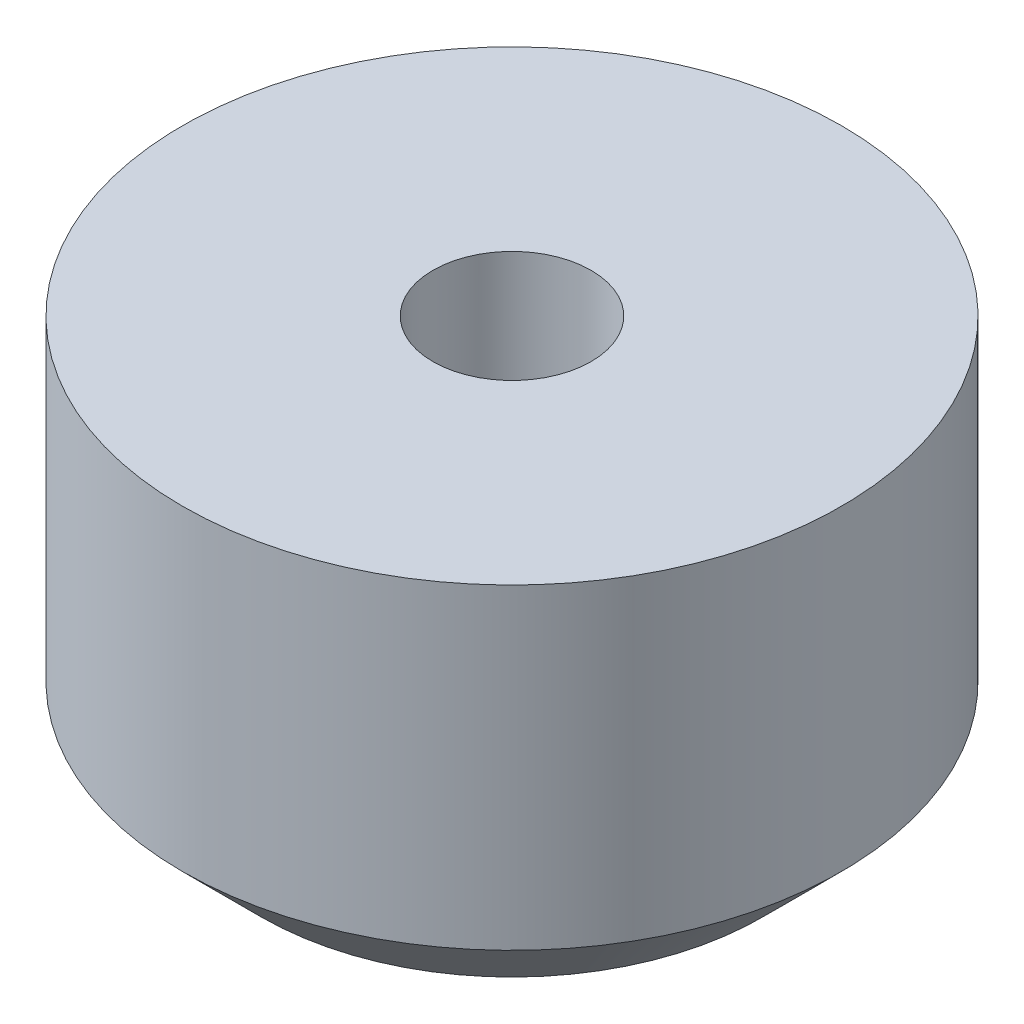
ISO-10303-21;
HEADER;
FILE_DESCRIPTION(('STEP AP214'),'2;1');
FILE_NAME('part.step','',(''),(''),'','','');
FILE_SCHEMA(('AUTOMOTIVE_DESIGN { 1 0 10303 214 1 1 1 1 }'));
ENDSEC;
DATA;
#1=APPLICATION_CONTEXT('core data for automotive mechanical design processes');
#2=APPLICATION_PROTOCOL_DEFINITION('international standard','automotive_design',2000,#1);
#3=PRODUCT_CONTEXT('',#1,'mechanical');
#4=PRODUCT('Part','Part','',(#3));
#5=PRODUCT_RELATED_PRODUCT_CATEGORY('part','',(#4));
#6=PRODUCT_DEFINITION_FORMATION('','',#4);
#7=PRODUCT_DEFINITION_CONTEXT('part definition',#1,'design');
#8=PRODUCT_DEFINITION('design','',#6,#7);
#9=PRODUCT_DEFINITION_SHAPE('','',#8);
#10=(LENGTH_UNIT() NAMED_UNIT(*) SI_UNIT(.MILLI.,.METRE.));
#11=(NAMED_UNIT(*) PLANE_ANGLE_UNIT() SI_UNIT($,.RADIAN.));
#12=(NAMED_UNIT(*) SI_UNIT($,.STERADIAN.) SOLID_ANGLE_UNIT());
#13=UNCERTAINTY_MEASURE_WITH_UNIT(LENGTH_MEASURE(1.E-05),#10,'distance_accuracy_value','');
#14=(GEOMETRIC_REPRESENTATION_CONTEXT(3) GLOBAL_UNCERTAINTY_ASSIGNED_CONTEXT((#13)) GLOBAL_UNIT_ASSIGNED_CONTEXT((#10,
#11,#12)) REPRESENTATION_CONTEXT('',''));
#15=CARTESIAN_POINT('',(0.,0.,0.));
#16=DIRECTION('',(0.,0.,1.));
#17=DIRECTION('',(1.,0.,0.));
#18=AXIS2_PLACEMENT_3D('',#15,#16,#17);
#19=CARTESIAN_POINT('',(0.,15.,0.));
#20=DIRECTION('',(0.,-1.,0.));
#21=DIRECTION('',(0.,0.,-1.));
#22=AXIS2_PLACEMENT_3D('',#19,#20,#21);
#23=CYLINDRICAL_SURFACE('',#22,3.);
#24=CARTESIAN_POINT('',(0.,15.,0.));
#25=DIRECTION('',(0.,1.,0.));
#26=DIRECTION('',(0.,0.,1.));
#27=AXIS2_PLACEMENT_3D('',#24,#25,#26);
#28=CIRCLE('',#27,3.);
#29=CARTESIAN_POINT('',(0.,15.,3.));
#30=VERTEX_POINT('',#29);
#31=EDGE_CURVE('E48',#30,#30,#28,.T.);
#32=ORIENTED_EDGE('',*,*,#31,.T.);
#33=EDGE_LOOP('',(#32));
#34=FACE_BOUND('',#33,.T.);
#35=CARTESIAN_POINT('',(0.,7.,0.));
#36=DIRECTION('',(0.,-1.,0.));
#37=DIRECTION('',(0.,0.,-1.));
#38=AXIS2_PLACEMENT_3D('',#35,#36,#37);
#39=CIRCLE('',#38,3.);
#40=CARTESIAN_POINT('',(0.,7.,-3.));
#41=VERTEX_POINT('',#40);
#42=EDGE_CURVE('E35',#41,#41,#39,.T.);
#43=ORIENTED_EDGE('',*,*,#42,.T.);
#44=EDGE_LOOP('',(#43));
#45=FACE_BOUND('',#44,.T.);
#46=ADVANCED_FACE('F31',(#34,#45),#23,.F.);
#47=CARTESIAN_POINT('',(0.,15.,0.));
#48=DIRECTION('',(0.,1.,0.));
#49=DIRECTION('',(0.,0.,1.));
#50=AXIS2_PLACEMENT_3D('',#47,#48,#49);
#51=PLANE('',#50);
#52=CARTESIAN_POINT('',(0.,15.,0.));
#53=DIRECTION('',(0.,1.,0.));
#54=DIRECTION('',(0.,0.,1.));
#55=AXIS2_PLACEMENT_3D('',#52,#53,#54);
#56=CIRCLE('',#55,12.5);
#57=CARTESIAN_POINT('',(0.,15.,12.5));
#58=VERTEX_POINT('',#57);
#59=EDGE_CURVE('E43',#58,#58,#56,.T.);
#60=ORIENTED_EDGE('',*,*,#59,.T.);
#61=EDGE_LOOP('',(#60));
#62=FACE_BOUND('',#61,.T.);
#63=ORIENTED_EDGE('',*,*,#31,.F.);
#64=EDGE_LOOP('',(#63));
#65=FACE_BOUND('',#64,.T.);
#66=ADVANCED_FACE('F72',(#62,#65),#51,.T.);
#67=CARTESIAN_POINT('',(0.,0.,0.));
#68=DIRECTION('',(0.,1.,0.));
#69=DIRECTION('',(0.,0.,1.));
#70=AXIS2_PLACEMENT_3D('',#67,#68,#69);
#71=PLANE('',#70);
#72=CARTESIAN_POINT('',(0.,0.,0.));
#73=DIRECTION('',(0.,-1.,0.));
#74=DIRECTION('',(0.,0.,-1.));
#75=AXIS2_PLACEMENT_3D('',#72,#73,#74);
#76=CIRCLE('',#75,6.);
#77=CARTESIAN_POINT('',(0.,0.,-6.));
#78=VERTEX_POINT('',#77);
#79=EDGE_CURVE('E51',#78,#78,#76,.T.);
#80=ORIENTED_EDGE('',*,*,#79,.F.);
#81=EDGE_LOOP('',(#80));
#82=FACE_BOUND('',#81,.T.);
#83=CARTESIAN_POINT('',(0.,0.,0.));
#84=DIRECTION('',(0.,1.,0.));
#85=DIRECTION('',(0.,0.,1.));
#86=AXIS2_PLACEMENT_3D('',#83,#84,#85);
#87=CIRCLE('',#86,9.49999999999999);
#88=CARTESIAN_POINT('',(0.,0.,9.49999999999999));
#89=VERTEX_POINT('',#88);
#90=EDGE_CURVE('E10',#89,#89,#87,.F.);
#91=ORIENTED_EDGE('',*,*,#90,.T.);
#92=EDGE_LOOP('',(#91));
#93=FACE_BOUND('',#92,.T.);
#94=ADVANCED_FACE('F78',(#82,#93),#71,.F.);
#95=CARTESIAN_POINT('',(0.,15.,0.));
#96=DIRECTION('',(0.,-1.,0.));
#97=DIRECTION('',(0.,0.,-1.));
#98=AXIS2_PLACEMENT_3D('',#95,#96,#97);
#99=CYLINDRICAL_SURFACE('',#98,12.5);
#100=CARTESIAN_POINT('',(0.,3.,0.));
#101=DIRECTION('',(0.,1.,0.));
#102=DIRECTION('',(0.,0.,1.));
#103=AXIS2_PLACEMENT_3D('',#100,#101,#102);
#104=CIRCLE('',#103,12.5);
#105=CARTESIAN_POINT('',(0.,3.,12.5));
#106=VERTEX_POINT('',#105);
#107=EDGE_CURVE('E39',#106,#106,#104,.T.);
#108=ORIENTED_EDGE('',*,*,#107,.T.);
#109=EDGE_LOOP('',(#108));
#110=FACE_BOUND('',#109,.T.);
#111=ORIENTED_EDGE('',*,*,#59,.F.);
#112=EDGE_LOOP('',(#111));
#113=FACE_BOUND('',#112,.T.);
#114=ADVANCED_FACE('F83',(#110,#113),#99,.T.);
#115=CARTESIAN_POINT('',(0.,3.,0.));
#116=DIRECTION('',(0.,1.,0.));
#117=DIRECTION('',(0.,0.,1.));
#118=AXIS2_PLACEMENT_3D('',#115,#116,#117);
#119=CONICAL_SURFACE('',#118,12.5,0.78539816339745);
#120=ORIENTED_EDGE('',*,*,#90,.F.);
#121=EDGE_LOOP('',(#120));
#122=FACE_BOUND('',#121,.T.);
#123=ORIENTED_EDGE('',*,*,#107,.F.);
#124=EDGE_LOOP('',(#123));
#125=FACE_BOUND('',#124,.T.);
#126=ADVANCED_FACE('F33',(#122,#125),#119,.T.);
#127=CARTESIAN_POINT('',(0.,7.,0.));
#128=DIRECTION('',(0.,-1.,0.));
#129=DIRECTION('',(0.,0.,-1.));
#130=AXIS2_PLACEMENT_3D('',#127,#128,#129);
#131=CYLINDRICAL_SURFACE('',#130,6.);
#132=CARTESIAN_POINT('',(0.,7.,0.));
#133=DIRECTION('',(0.,-1.,0.));
#134=DIRECTION('',(0.,0.,-1.));
#135=AXIS2_PLACEMENT_3D('',#132,#133,#134);
#136=CIRCLE('',#135,6.);
#137=CARTESIAN_POINT('',(0.,7.,-6.));
#138=VERTEX_POINT('',#137);
#139=EDGE_CURVE('E54',#138,#138,#136,.T.);
#140=ORIENTED_EDGE('',*,*,#139,.F.);
#141=EDGE_LOOP('',(#140));
#142=FACE_BOUND('',#141,.T.);
#143=ORIENTED_EDGE('',*,*,#79,.T.);
#144=EDGE_LOOP('',(#143));
#145=FACE_BOUND('',#144,.T.);
#146=ADVANCED_FACE('F64',(#142,#145),#131,.F.);
#147=CARTESIAN_POINT('',(0.,7.,0.));
#148=DIRECTION('',(0.,-1.,0.));
#149=DIRECTION('',(0.,0.,-1.));
#150=AXIS2_PLACEMENT_3D('',#147,#148,#149);
#151=PLANE('',#150);
#152=ORIENTED_EDGE('',*,*,#42,.F.);
#153=EDGE_LOOP('',(#152));
#154=FACE_BOUND('',#153,.T.);
#155=ORIENTED_EDGE('',*,*,#139,.T.);
#156=EDGE_LOOP('',(#155));
#157=FACE_BOUND('',#156,.T.);
#158=ADVANCED_FACE('F62',(#154,#157),#151,.T.);
#159=CLOSED_SHELL('',(#46,#66,#94,#114,#126,#146,#158));
#160=MANIFOLD_SOLID_BREP('B2',#159);
#161=ADVANCED_BREP_SHAPE_REPRESENTATION('',(#18,#160),#14);
#162=SHAPE_DEFINITION_REPRESENTATION(#9,#161);
ENDSEC;
END-ISO-10303-21;
